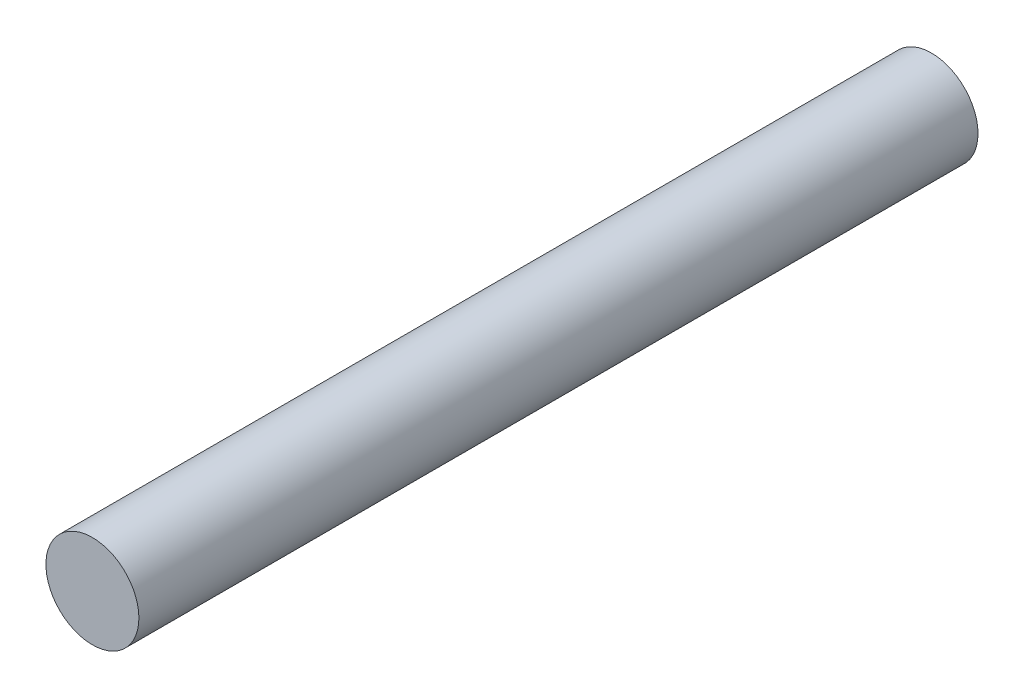
ISO-10303-21;
HEADER;
FILE_DESCRIPTION(('STEP AP214'),'2;1');
FILE_NAME('part.step','',(''),(''),'','','');
FILE_SCHEMA(('AUTOMOTIVE_DESIGN { 1 0 10303 214 1 1 1 1 }'));
ENDSEC;
DATA;
#1=APPLICATION_CONTEXT('core data for automotive mechanical design processes');
#2=APPLICATION_PROTOCOL_DEFINITION('international standard','automotive_design',2000,#1);
#3=PRODUCT_CONTEXT('',#1,'mechanical');
#4=PRODUCT('Part','Part','',(#3));
#5=PRODUCT_RELATED_PRODUCT_CATEGORY('part','',(#4));
#6=PRODUCT_DEFINITION_FORMATION('','',#4);
#7=PRODUCT_DEFINITION_CONTEXT('part definition',#1,'design');
#8=PRODUCT_DEFINITION('design','',#6,#7);
#9=PRODUCT_DEFINITION_SHAPE('','',#8);
#10=(LENGTH_UNIT() NAMED_UNIT(*) SI_UNIT(.MILLI.,.METRE.));
#11=(NAMED_UNIT(*) PLANE_ANGLE_UNIT() SI_UNIT($,.RADIAN.));
#12=(NAMED_UNIT(*) SI_UNIT($,.STERADIAN.) SOLID_ANGLE_UNIT());
#13=UNCERTAINTY_MEASURE_WITH_UNIT(LENGTH_MEASURE(1.E-05),#10,'distance_accuracy_value','');
#14=(GEOMETRIC_REPRESENTATION_CONTEXT(3) GLOBAL_UNCERTAINTY_ASSIGNED_CONTEXT((#13)) GLOBAL_UNIT_ASSIGNED_CONTEXT((#10,
#11,#12)) REPRESENTATION_CONTEXT('',''));
#15=CARTESIAN_POINT('',(0.,0.,0.));
#16=DIRECTION('',(0.,0.,1.));
#17=DIRECTION('',(1.,0.,0.));
#18=AXIS2_PLACEMENT_3D('',#15,#16,#17);
#19=CARTESIAN_POINT('',(0.,0.,37.));
#20=DIRECTION('',(0.,0.,-1.));
#21=DIRECTION('',(-1.,0.,0.));
#22=AXIS2_PLACEMENT_3D('',#19,#20,#21);
#23=CYLINDRICAL_SURFACE('',#22,2.05);
#24=CARTESIAN_POINT('',(0.,0.,37.));
#25=DIRECTION('',(0.,0.,1.));
#26=DIRECTION('',(1.,0.,0.));
#27=AXIS2_PLACEMENT_3D('',#24,#25,#26);
#28=CIRCLE('',#27,2.05);
#29=CARTESIAN_POINT('',(2.05,0.,37.));
#30=VERTEX_POINT('',#29);
#31=EDGE_CURVE('E10',#30,#30,#28,.T.);
#32=ORIENTED_EDGE('',*,*,#31,.F.);
#33=EDGE_LOOP('',(#32));
#34=FACE_BOUND('',#33,.T.);
#35=CARTESIAN_POINT('',(0.,0.,0.));
#36=DIRECTION('',(0.,0.,1.));
#37=DIRECTION('',(1.,0.,0.));
#38=AXIS2_PLACEMENT_3D('',#35,#36,#37);
#39=CIRCLE('',#38,2.05);
#40=CARTESIAN_POINT('',(2.05,0.,0.));
#41=VERTEX_POINT('',#40);
#42=EDGE_CURVE('E44',#41,#41,#39,.T.);
#43=ORIENTED_EDGE('',*,*,#42,.T.);
#44=EDGE_LOOP('',(#43));
#45=FACE_BOUND('',#44,.T.);
#46=ADVANCED_FACE('F41',(#34,#45),#23,.T.);
#47=CARTESIAN_POINT('',(0.,0.,37.));
#48=DIRECTION('',(0.,0.,1.));
#49=DIRECTION('',(1.,0.,0.));
#50=AXIS2_PLACEMENT_3D('',#47,#48,#49);
#51=PLANE('',#50);
#52=ORIENTED_EDGE('',*,*,#31,.T.);
#53=EDGE_LOOP('',(#52));
#54=FACE_BOUND('',#53,.T.);
#55=ADVANCED_FACE('F58',(#54),#51,.T.);
#56=CARTESIAN_POINT('',(0.,0.,0.));
#57=DIRECTION('',(0.,0.,1.));
#58=DIRECTION('',(1.,0.,0.));
#59=AXIS2_PLACEMENT_3D('',#56,#57,#58);
#60=PLANE('',#59);
#61=ORIENTED_EDGE('',*,*,#42,.F.);
#62=EDGE_LOOP('',(#61));
#63=FACE_BOUND('',#62,.T.);
#64=ADVANCED_FACE('F56',(#63),#60,.F.);
#65=CLOSED_SHELL('',(#46,#55,#64));
#66=MANIFOLD_SOLID_BREP('B2',#65);
#67=ADVANCED_BREP_SHAPE_REPRESENTATION('',(#18,#66),#14);
#68=SHAPE_DEFINITION_REPRESENTATION(#9,#67);
ENDSEC;
END-ISO-10303-21;
